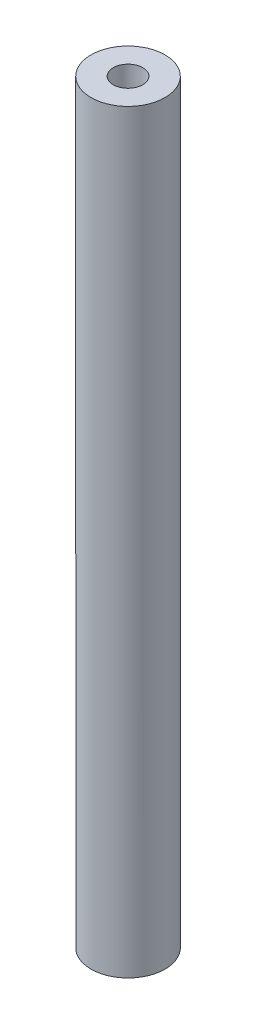
ISO-10303-21;
HEADER;
FILE_DESCRIPTION(('STEP AP214'),'2;1');
FILE_NAME('part.step','',(''),(''),'','','');
FILE_SCHEMA(('AUTOMOTIVE_DESIGN { 1 0 10303 214 1 1 1 1 }'));
ENDSEC;
DATA;
#1=APPLICATION_CONTEXT('core data for automotive mechanical design processes');
#2=APPLICATION_PROTOCOL_DEFINITION('international standard','automotive_design',2000,#1);
#3=PRODUCT_CONTEXT('',#1,'mechanical');
#4=PRODUCT('Part','Part','',(#3));
#5=PRODUCT_RELATED_PRODUCT_CATEGORY('part','',(#4));
#6=PRODUCT_DEFINITION_FORMATION('','',#4);
#7=PRODUCT_DEFINITION_CONTEXT('part definition',#1,'design');
#8=PRODUCT_DEFINITION('design','',#6,#7);
#9=PRODUCT_DEFINITION_SHAPE('','',#8);
#10=(LENGTH_UNIT() NAMED_UNIT(*) SI_UNIT(.MILLI.,.METRE.));
#11=(NAMED_UNIT(*) PLANE_ANGLE_UNIT() SI_UNIT($,.RADIAN.));
#12=(NAMED_UNIT(*) SI_UNIT($,.STERADIAN.) SOLID_ANGLE_UNIT());
#13=UNCERTAINTY_MEASURE_WITH_UNIT(LENGTH_MEASURE(1.E-05),#10,'distance_accuracy_value','');
#14=(GEOMETRIC_REPRESENTATION_CONTEXT(3) GLOBAL_UNCERTAINTY_ASSIGNED_CONTEXT((#13)) GLOBAL_UNIT_ASSIGNED_CONTEXT((#10,
#11,#12)) REPRESENTATION_CONTEXT('',''));
#15=CARTESIAN_POINT('',(0.,0.,0.));
#16=DIRECTION('',(0.,0.,1.));
#17=DIRECTION('',(1.,0.,0.));
#18=AXIS2_PLACEMENT_3D('',#15,#16,#17);
#19=CARTESIAN_POINT('',(0.,0.,0.));
#20=DIRECTION('',(0.,1.,0.));
#21=DIRECTION('',(1.,0.,0.));
#22=AXIS2_PLACEMENT_3D('',#19,#20,#21);
#23=PLANE('',#22);
#24=CARTESIAN_POINT('',(0.,0.,0.));
#25=DIRECTION('',(0.,1.,0.));
#26=DIRECTION('',(-1.,0.,0.));
#27=AXIS2_PLACEMENT_3D('',#24,#25,#26);
#28=CIRCLE('',#27,2.5);
#29=CARTESIAN_POINT('',(-2.5,0.,0.));
#30=VERTEX_POINT('',#29);
#31=EDGE_CURVE('E10',#30,#30,#28,.T.);
#32=ORIENTED_EDGE('',*,*,#31,.F.);
#33=EDGE_LOOP('',(#32));
#34=FACE_BOUND('',#33,.T.);
#35=ADVANCED_FACE('F15',(#34),#23,.F.);
#36=CARTESIAN_POINT('',(0.,0.,0.));
#37=DIRECTION('',(0.,1.,0.));
#38=DIRECTION('',(1.,0.,0.));
#39=AXIS2_PLACEMENT_3D('',#36,#37,#38);
#40=CYLINDRICAL_SURFACE('',#39,2.5);
#41=CARTESIAN_POINT('',(0.,51.,0.));
#42=DIRECTION('',(0.,1.,0.));
#43=DIRECTION('',(1.,0.,0.));
#44=AXIS2_PLACEMENT_3D('',#41,#42,#43);
#45=CIRCLE('',#44,2.5);
#46=CARTESIAN_POINT('',(2.5,51.,0.));
#47=VERTEX_POINT('',#46);
#48=EDGE_CURVE('E23',#47,#47,#45,.T.);
#49=ORIENTED_EDGE('',*,*,#48,.F.);
#50=EDGE_LOOP('',(#49));
#51=FACE_BOUND('',#50,.T.);
#52=ORIENTED_EDGE('',*,*,#31,.T.);
#53=EDGE_LOOP('',(#52));
#54=FACE_BOUND('',#53,.T.);
#55=ADVANCED_FACE('F46',(#51,#54),#40,.T.);
#56=CARTESIAN_POINT('',(0.,51.,0.));
#57=DIRECTION('',(0.,1.,0.));
#58=DIRECTION('',(1.,0.,0.));
#59=AXIS2_PLACEMENT_3D('',#56,#57,#58);
#60=PLANE('',#59);
#61=ORIENTED_EDGE('',*,*,#48,.T.);
#62=EDGE_LOOP('',(#61));
#63=FACE_BOUND('',#62,.T.);
#64=CARTESIAN_POINT('',(0.,51.,0.));
#65=DIRECTION('',(0.,-1.,0.));
#66=DIRECTION('',(-1.,0.,0.));
#67=AXIS2_PLACEMENT_3D('',#64,#65,#66);
#68=CIRCLE('',#67,1.);
#69=CARTESIAN_POINT('',(-1.,51.,0.));
#70=VERTEX_POINT('',#69);
#71=EDGE_CURVE('E28',#70,#70,#68,.T.);
#72=ORIENTED_EDGE('',*,*,#71,.T.);
#73=EDGE_LOOP('',(#72));
#74=FACE_BOUND('',#73,.T.);
#75=ADVANCED_FACE('F44',(#63,#74),#60,.T.);
#76=CARTESIAN_POINT('',(0.,51.,0.));
#77=DIRECTION('',(0.,-1.,0.));
#78=DIRECTION('',(1.,0.,0.));
#79=AXIS2_PLACEMENT_3D('',#76,#77,#78);
#80=CYLINDRICAL_SURFACE('',#79,1.);
#81=CARTESIAN_POINT('',(0.,46.,0.));
#82=DIRECTION('',(0.,-1.,0.));
#83=DIRECTION('',(1.,0.,0.));
#84=AXIS2_PLACEMENT_3D('',#81,#82,#83);
#85=CIRCLE('',#84,1.);
#86=CARTESIAN_POINT('',(1.,46.,0.));
#87=VERTEX_POINT('',#86);
#88=EDGE_CURVE('E19',#87,#87,#85,.T.);
#89=ORIENTED_EDGE('',*,*,#88,.T.);
#90=EDGE_LOOP('',(#89));
#91=FACE_BOUND('',#90,.T.);
#92=ORIENTED_EDGE('',*,*,#71,.F.);
#93=EDGE_LOOP('',(#92));
#94=FACE_BOUND('',#93,.T.);
#95=ADVANCED_FACE('F36',(#91,#94),#80,.F.);
#96=CARTESIAN_POINT('',(0.,46.,0.));
#97=DIRECTION('',(0.,-1.,0.));
#98=DIRECTION('',(1.,0.,0.));
#99=AXIS2_PLACEMENT_3D('',#96,#97,#98);
#100=PLANE('',#99);
#101=ORIENTED_EDGE('',*,*,#88,.F.);
#102=EDGE_LOOP('',(#101));
#103=FACE_BOUND('',#102,.T.);
#104=ADVANCED_FACE('F17',(#103),#100,.F.);
#105=CLOSED_SHELL('',(#35,#55,#75,#95,#104));
#106=MANIFOLD_SOLID_BREP('B1',#105);
#107=ADVANCED_BREP_SHAPE_REPRESENTATION('',(#18,#106),#14);
#108=SHAPE_DEFINITION_REPRESENTATION(#9,#107);
ENDSEC;
END-ISO-10303-21;
